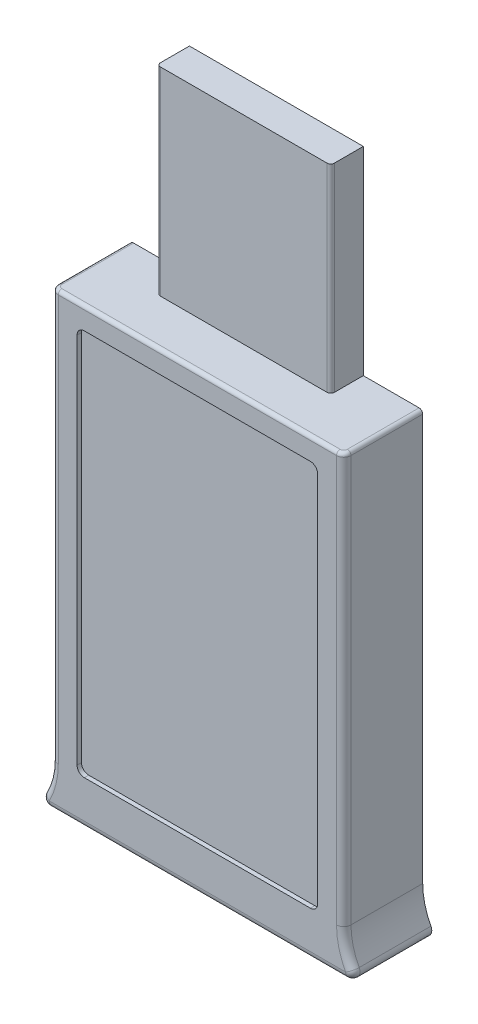
ISO-10303-21;
HEADER;
FILE_DESCRIPTION(('STEP AP214'),'2;1');
FILE_NAME('part.step','',(''),(''),'','','');
FILE_SCHEMA(('AUTOMOTIVE_DESIGN { 1 0 10303 214 1 1 1 1 }'));
ENDSEC;
DATA;
#1=APPLICATION_CONTEXT('core data for automotive mechanical design processes');
#2=APPLICATION_PROTOCOL_DEFINITION('international standard','automotive_design',2000,#1);
#3=PRODUCT_CONTEXT('',#1,'mechanical');
#4=PRODUCT('Part','Part','',(#3));
#5=PRODUCT_RELATED_PRODUCT_CATEGORY('part','',(#4));
#6=PRODUCT_DEFINITION_FORMATION('','',#4);
#7=PRODUCT_DEFINITION_CONTEXT('part definition',#1,'design');
#8=PRODUCT_DEFINITION('design','',#6,#7);
#9=PRODUCT_DEFINITION_SHAPE('','',#8);
#10=(LENGTH_UNIT() NAMED_UNIT(*) SI_UNIT(.MILLI.,.METRE.));
#11=(NAMED_UNIT(*) PLANE_ANGLE_UNIT() SI_UNIT($,.RADIAN.));
#12=(NAMED_UNIT(*) SI_UNIT($,.STERADIAN.) SOLID_ANGLE_UNIT());
#13=UNCERTAINTY_MEASURE_WITH_UNIT(LENGTH_MEASURE(1.E-05),#10,'distance_accuracy_value','');
#14=(GEOMETRIC_REPRESENTATION_CONTEXT(3) GLOBAL_UNCERTAINTY_ASSIGNED_CONTEXT((#13)) GLOBAL_UNIT_ASSIGNED_CONTEXT((#10,
#11,#12)) REPRESENTATION_CONTEXT('',''));
#15=CARTESIAN_POINT('',(0.,0.,0.));
#16=DIRECTION('',(0.,0.,1.));
#17=DIRECTION('',(1.,0.,0.));
#18=AXIS2_PLACEMENT_3D('',#15,#16,#17);
#19=CARTESIAN_POINT('',(0.,0.,-2.25));
#20=DIRECTION('',(1.,0.,0.));
#21=DIRECTION('',(0.,0.,-1.));
#22=AXIS2_PLACEMENT_3D('',#19,#20,#21);
#23=PLANE('',#22);
#24=DIRECTION('',(0.,0.,1.));
#25=VECTOR('',#24,1.);
#26=CARTESIAN_POINT('',(0.,13.7,-2.25));
#27=LINE('',#26,#25);
#28=CARTESIAN_POINT('',(0.,13.7,0.));
#29=VERTEX_POINT('',#28);
#30=CARTESIAN_POINT('',(0.,13.7,2.));
#31=VERTEX_POINT('',#30);
#32=EDGE_CURVE('E594',#29,#31,#27,.T.);
#33=ORIENTED_EDGE('',*,*,#32,.F.);
#34=DIRECTION('',(0.,-1.,0.));
#35=VECTOR('',#34,1.);
#36=CARTESIAN_POINT('',(0.,0.,0.));
#37=LINE('',#36,#35);
#38=CARTESIAN_POINT('',(0.,0.,0.));
#39=VERTEX_POINT('',#38);
#40=EDGE_CURVE('E249',#29,#39,#37,.T.);
#41=ORIENTED_EDGE('',*,*,#40,.T.);
#42=DIRECTION('',(0.,0.,1.));
#43=VECTOR('',#42,1.);
#44=CARTESIAN_POINT('',(0.,0.,-2.25));
#45=LINE('',#44,#43);
#46=CARTESIAN_POINT('',(0.,0.,2.));
#47=VERTEX_POINT('',#46);
#48=EDGE_CURVE('E247',#39,#47,#45,.T.);
#49=ORIENTED_EDGE('',*,*,#48,.T.);
#50=DIRECTION('',(0.,1.,0.));
#51=VECTOR('',#50,1.);
#52=CARTESIAN_POINT('',(0.,13.7,2.));
#53=LINE('',#52,#51);
#54=EDGE_CURVE('E295',#47,#31,#53,.T.);
#55=ORIENTED_EDGE('',*,*,#54,.T.);
#56=EDGE_LOOP('',(#33,#41,#49,#55));
#57=FACE_BOUND('',#56,.T.);
#58=ADVANCED_FACE('F47',(#57),#23,.F.);
#59=CARTESIAN_POINT('',(0.,13.7,-2.25));
#60=DIRECTION('',(0.,-1.,0.));
#61=DIRECTION('',(0.,0.,-1.));
#62=AXIS2_PLACEMENT_3D('',#59,#60,#61);
#63=PLANE('',#62);
#64=DIRECTION('',(0.,0.,1.));
#65=VECTOR('',#64,1.);
#66=CARTESIAN_POINT('',(12.,13.7,-2.25));
#67=LINE('',#66,#65);
#68=CARTESIAN_POINT('',(12.,13.7,0.));
#69=VERTEX_POINT('',#68);
#70=CARTESIAN_POINT('',(12.,13.7,2.));
#71=VERTEX_POINT('',#70);
#72=EDGE_CURVE('E70',#69,#71,#67,.T.);
#73=ORIENTED_EDGE('',*,*,#72,.F.);
#74=DIRECTION('',(1.,0.,0.));
#75=VECTOR('',#74,1.);
#76=CARTESIAN_POINT('',(0.3,13.7,0.));
#77=LINE('',#76,#75);
#78=EDGE_CURVE('E384',#29,#69,#77,.T.);
#79=ORIENTED_EDGE('',*,*,#78,.F.);
#80=ORIENTED_EDGE('',*,*,#32,.T.);
#81=CARTESIAN_POINT('',(0.25,13.7,2.));
#82=DIRECTION('',(0.,-1.,0.));
#83=DIRECTION('',(0.,0.,-1.));
#84=AXIS2_PLACEMENT_3D('',#81,#82,#83);
#85=CIRCLE('',#84,0.25);
#86=CARTESIAN_POINT('',(0.25,13.7,2.25));
#87=VERTEX_POINT('',#86);
#88=EDGE_CURVE('E286',#31,#87,#85,.F.);
#89=ORIENTED_EDGE('',*,*,#88,.T.);
#90=DIRECTION('',(1.,0.,0.));
#91=VECTOR('',#90,1.);
#92=CARTESIAN_POINT('',(0.,13.7,2.25));
#93=LINE('',#92,#91);
#94=CARTESIAN_POINT('',(11.75,13.7,2.25));
#95=VERTEX_POINT('',#94);
#96=EDGE_CURVE('E591',#87,#95,#93,.T.);
#97=ORIENTED_EDGE('',*,*,#96,.T.);
#98=CARTESIAN_POINT('',(11.75,13.7,2.));
#99=DIRECTION('',(0.,-1.,0.));
#100=DIRECTION('',(0.,0.,-1.));
#101=AXIS2_PLACEMENT_3D('',#98,#99,#100);
#102=CIRCLE('',#101,0.25);
#103=EDGE_CURVE('E289',#95,#71,#102,.F.);
#104=ORIENTED_EDGE('',*,*,#103,.T.);
#105=EDGE_LOOP('',(#73,#79,#80,#89,#97,#104));
#106=FACE_BOUND('',#105,.T.);
#107=ADVANCED_FACE('F636',(#106),#63,.F.);
#108=CARTESIAN_POINT('',(12.,0.,-2.25));
#109=DIRECTION('',(1.,0.,0.));
#110=DIRECTION('',(0.,0.,-1.));
#111=AXIS2_PLACEMENT_3D('',#108,#109,#110);
#112=PLANE('',#111);
#113=DIRECTION('',(0.,-1.,0.));
#114=VECTOR('',#113,1.);
#115=CARTESIAN_POINT('',(12.,0.,0.));
#116=LINE('',#115,#114);
#117=CARTESIAN_POINT('',(12.,0.,0.));
#118=VERTEX_POINT('',#117);
#119=EDGE_CURVE('E414',#69,#118,#116,.T.);
#120=ORIENTED_EDGE('',*,*,#119,.F.);
#121=ORIENTED_EDGE('',*,*,#72,.T.);
#122=DIRECTION('',(0.,1.,0.));
#123=VECTOR('',#122,1.);
#124=CARTESIAN_POINT('',(12.,0.,2.));
#125=LINE('',#124,#123);
#126=CARTESIAN_POINT('',(12.,0.,2.));
#127=VERTEX_POINT('',#126);
#128=EDGE_CURVE('E292',#71,#127,#125,.F.);
#129=ORIENTED_EDGE('',*,*,#128,.T.);
#130=DIRECTION('',(0.,0.,1.));
#131=VECTOR('',#130,1.);
#132=CARTESIAN_POINT('',(12.,0.,-2.25));
#133=LINE('',#132,#131);
#134=EDGE_CURVE('E588',#118,#127,#133,.T.);
#135=ORIENTED_EDGE('',*,*,#134,.F.);
#136=EDGE_LOOP('',(#120,#121,#129,#135));
#137=FACE_BOUND('',#136,.T.);
#138=ADVANCED_FACE('F643',(#137),#112,.T.);
#139=CARTESIAN_POINT('',(0.,0.,2.25));
#140=DIRECTION('',(0.,0.,1.));
#141=DIRECTION('',(1.,0.,0.));
#142=AXIS2_PLACEMENT_3D('',#139,#140,#141);
#143=PLANE('',#142);
#144=DIRECTION('',(1.,0.,0.));
#145=VECTOR('',#144,1.);
#146=CARTESIAN_POINT('',(0.,0.,2.25));
#147=LINE('',#146,#145);
#148=CARTESIAN_POINT('',(0.25,0.,2.25));
#149=VERTEX_POINT('',#148);
#150=CARTESIAN_POINT('',(11.75,0.,2.25));
#151=VERTEX_POINT('',#150);
#152=EDGE_CURVE('E602',#149,#151,#147,.T.);
#153=ORIENTED_EDGE('',*,*,#152,.T.);
#154=DIRECTION('',(0.,1.,0.));
#155=VECTOR('',#154,1.);
#156=CARTESIAN_POINT('',(11.75,0.,2.25));
#157=LINE('',#156,#155);
#158=EDGE_CURVE('E282',#151,#95,#157,.T.);
#159=ORIENTED_EDGE('',*,*,#158,.T.);
#160=ORIENTED_EDGE('',*,*,#96,.F.);
#161=DIRECTION('',(0.,1.,0.));
#162=VECTOR('',#161,1.);
#163=CARTESIAN_POINT('',(0.25,0.,2.25));
#164=LINE('',#163,#162);
#165=EDGE_CURVE('E279',#87,#149,#164,.F.);
#166=ORIENTED_EDGE('',*,*,#165,.T.);
#167=EDGE_LOOP('',(#153,#159,#160,#166));
#168=FACE_BOUND('',#167,.T.);
#169=ADVANCED_FACE('F648',(#168),#143,.T.);
#170=CARTESIAN_POINT('',(16.1,0.,43.4196706915668));
#171=DIRECTION('',(1.,0.,0.));
#172=DIRECTION('',(0.,0.,-1.));
#173=AXIS2_PLACEMENT_3D('',#170,#171,#172);
#174=PLANE('',#173);
#175=DIRECTION('',(0.,-1.,0.));
#176=VECTOR('',#175,1.);
#177=CARTESIAN_POINT('',(16.1,0.,0.));
#178=LINE('',#177,#176);
#179=CARTESIAN_POINT('',(16.1,-0.25,0.));
#180=VERTEX_POINT('',#179);
#181=CARTESIAN_POINT('',(16.1,-28.3,0.));
#182=VERTEX_POINT('',#181);
#183=EDGE_CURVE('E360',#180,#182,#178,.T.);
#184=ORIENTED_EDGE('',*,*,#183,.F.);
#185=DIRECTION('',(0.,0.,-1.));
#186=VECTOR('',#185,1.);
#187=CARTESIAN_POINT('',(16.1,-0.25,43.4196706915668));
#188=LINE('',#187,#186);
#189=CARTESIAN_POINT('',(16.1,-0.25,4.95));
#190=VERTEX_POINT('',#189);
#191=EDGE_CURVE('E273',#180,#190,#188,.F.);
#192=ORIENTED_EDGE('',*,*,#191,.T.);
#193=DIRECTION('',(0.,-1.,0.));
#194=VECTOR('',#193,1.);
#195=CARTESIAN_POINT('',(16.1,0.,4.95));
#196=LINE('',#195,#194);
#197=CARTESIAN_POINT('',(16.1,-28.3,4.95));
#198=VERTEX_POINT('',#197);
#199=EDGE_CURVE('E496',#190,#198,#196,.T.);
#200=ORIENTED_EDGE('',*,*,#199,.T.);
#201=DIRECTION('',(0.,0.,-1.));
#202=VECTOR('',#201,1.);
#203=CARTESIAN_POINT('',(16.1,-28.3,43.4196706915668));
#204=LINE('',#203,#202);
#205=EDGE_CURVE('E404',#198,#182,#204,.T.);
#206=ORIENTED_EDGE('',*,*,#205,.T.);
#207=EDGE_LOOP('',(#184,#192,#200,#206));
#208=FACE_BOUND('',#207,.T.);
#209=ADVANCED_FACE('F665',(#208),#174,.T.);
#210=CARTESIAN_POINT('',(0.,0.,43.4196706915668));
#211=DIRECTION('',(0.,1.,0.));
#212=DIRECTION('',(0.,0.,1.));
#213=AXIS2_PLACEMENT_3D('',#210,#211,#212);
#214=PLANE('',#213);
#215=DIRECTION('',(1.,0.,0.));
#216=VECTOR('',#215,1.);
#217=CARTESIAN_POINT('',(0.,0.,0.));
#218=LINE('',#217,#216);
#219=CARTESIAN_POINT('',(-3.85,0.,0.));
#220=VERTEX_POINT('',#219);
#221=EDGE_CURVE('E234',#220,#39,#218,.T.);
#222=ORIENTED_EDGE('',*,*,#221,.F.);
#223=DIRECTION('',(0.,0.,-1.));
#224=VECTOR('',#223,1.);
#225=CARTESIAN_POINT('',(-3.85,0.,4.95));
#226=LINE('',#225,#224);
#227=CARTESIAN_POINT('',(-3.85,0.,4.95));
#228=VERTEX_POINT('',#227);
#229=EDGE_CURVE('E244',#220,#228,#226,.F.);
#230=ORIENTED_EDGE('',*,*,#229,.T.);
#231=CARTESIAN_POINT('',(-3.6,0.,4.95));
#232=DIRECTION('',(0.,1.,0.));
#233=DIRECTION('',(0.,0.,1.));
#234=AXIS2_PLACEMENT_3D('',#231,#232,#233);
#235=CIRCLE('',#234,0.25);
#236=CARTESIAN_POINT('',(-3.6,0.,5.2));
#237=VERTEX_POINT('',#236);
#238=EDGE_CURVE('E255',#228,#237,#235,.T.);
#239=ORIENTED_EDGE('',*,*,#238,.T.);
#240=DIRECTION('',(1.,0.,0.));
#241=VECTOR('',#240,1.);
#242=CARTESIAN_POINT('',(0.,0.,5.2));
#243=LINE('',#242,#241);
#244=CARTESIAN_POINT('',(15.6,0.,5.2));
#245=VERTEX_POINT('',#244);
#246=EDGE_CURVE('E347',#237,#245,#243,.T.);
#247=ORIENTED_EDGE('',*,*,#246,.T.);
#248=CARTESIAN_POINT('',(15.6,0.,4.95));
#249=DIRECTION('',(0.,1.,0.));
#250=DIRECTION('',(0.,0.,1.));
#251=AXIS2_PLACEMENT_3D('',#248,#249,#250);
#252=CIRCLE('',#251,0.25);
#253=CARTESIAN_POINT('',(15.85,0.,4.95));
#254=VERTEX_POINT('',#253);
#255=EDGE_CURVE('E263',#245,#254,#252,.T.);
#256=ORIENTED_EDGE('',*,*,#255,.T.);
#257=DIRECTION('',(0.,0.,-1.));
#258=VECTOR('',#257,1.);
#259=CARTESIAN_POINT('',(15.85,0.,43.4196706915668));
#260=LINE('',#259,#258);
#261=CARTESIAN_POINT('',(15.85,0.,0.));
#262=VERTEX_POINT('',#261);
#263=EDGE_CURVE('E256',#254,#262,#260,.T.);
#264=ORIENTED_EDGE('',*,*,#263,.T.);
#265=EDGE_CURVE('E250',#118,#262,#218,.T.);
#266=ORIENTED_EDGE('',*,*,#265,.F.);
#267=ORIENTED_EDGE('',*,*,#134,.T.);
#268=CARTESIAN_POINT('',(11.75,0.,2.));
#269=DIRECTION('',(0.,1.,0.));
#270=DIRECTION('',(0.,0.,1.));
#271=AXIS2_PLACEMENT_3D('',#268,#269,#270);
#272=CIRCLE('',#271,0.25);
#273=EDGE_CURVE('E302',#127,#151,#272,.F.);
#274=ORIENTED_EDGE('',*,*,#273,.T.);
#275=ORIENTED_EDGE('',*,*,#152,.F.);
#276=CARTESIAN_POINT('',(0.25,0.,2.));
#277=DIRECTION('',(0.,1.,0.));
#278=DIRECTION('',(0.,0.,1.));
#279=AXIS2_PLACEMENT_3D('',#276,#277,#278);
#280=CIRCLE('',#279,0.25);
#281=EDGE_CURVE('E56',#149,#47,#280,.F.);
#282=ORIENTED_EDGE('',*,*,#281,.T.);
#283=ORIENTED_EDGE('',*,*,#48,.F.);
#284=EDGE_LOOP('',(#222,#230,#239,#247,#256,#264,#266,#267,#274,#275,#282,#283));
#285=FACE_BOUND('',#284,.T.);
#286=ADVANCED_FACE('F242',(#285),#214,.T.);
#287=CARTESIAN_POINT('',(-4.1,0.,43.4196706915668));
#288=DIRECTION('',(1.,0.,0.));
#289=DIRECTION('',(0.,1.,0.));
#290=AXIS2_PLACEMENT_3D('',#287,#288,#289);
#291=PLANE('',#290);
#292=DIRECTION('',(0.,0.,-1.));
#293=VECTOR('',#292,1.);
#294=CARTESIAN_POINT('',(-4.1,-0.25,-4.65));
#295=LINE('',#294,#293);
#296=CARTESIAN_POINT('',(-4.1,-0.25,4.95));
#297=VERTEX_POINT('',#296);
#298=CARTESIAN_POINT('',(-4.1,-0.25,0.));
#299=VERTEX_POINT('',#298);
#300=EDGE_CURVE('E270',#297,#299,#295,.T.);
#301=ORIENTED_EDGE('',*,*,#300,.T.);
#302=DIRECTION('',(0.,-1.,0.));
#303=VECTOR('',#302,1.);
#304=CARTESIAN_POINT('',(-4.1,0.,0.));
#305=LINE('',#304,#303);
#306=CARTESIAN_POINT('',(-4.1,-28.3,0.));
#307=VERTEX_POINT('',#306);
#308=EDGE_CURVE('E62',#299,#307,#305,.T.);
#309=ORIENTED_EDGE('',*,*,#308,.T.);
#310=DIRECTION('',(0.,0.,-1.));
#311=VECTOR('',#310,1.);
#312=CARTESIAN_POINT('',(-4.1,-28.3,43.4196706915668));
#313=LINE('',#312,#311);
#314=CARTESIAN_POINT('',(-4.1,-28.3,4.95));
#315=VERTEX_POINT('',#314);
#316=EDGE_CURVE('E405',#315,#307,#313,.T.);
#317=ORIENTED_EDGE('',*,*,#316,.F.);
#318=DIRECTION('',(0.,-1.,0.));
#319=VECTOR('',#318,1.);
#320=CARTESIAN_POINT('',(-4.1,0.,4.95));
#321=LINE('',#320,#319);
#322=EDGE_CURVE('E569',#315,#297,#321,.F.);
#323=ORIENTED_EDGE('',*,*,#322,.T.);
#324=EDGE_LOOP('',(#301,#309,#317,#323));
#325=FACE_BOUND('',#324,.T.);
#326=ADVANCED_FACE('F616',(#325),#291,.F.);
#327=CARTESIAN_POINT('',(0.,0.,5.45));
#328=DIRECTION('',(0.,0.,1.));
#329=DIRECTION('',(1.,0.,0.));
#330=AXIS2_PLACEMENT_3D('',#327,#328,#329);
#331=PLANE('',#330);
#332=DIRECTION('',(0.,1.,0.));
#333=VECTOR('',#332,1.);
#334=CARTESIAN_POINT('',(14.3,-1.5,5.45));
#335=LINE('',#334,#333);
#336=CARTESIAN_POINT('',(14.3,-27.7,5.45));
#337=VERTEX_POINT('',#336);
#338=CARTESIAN_POINT('',(14.3,-2.,5.45));
#339=VERTEX_POINT('',#338);
#340=EDGE_CURVE('E385',#337,#339,#335,.T.);
#341=ORIENTED_EDGE('',*,*,#340,.F.);
#342=CARTESIAN_POINT('',(13.8,-27.7,5.45));
#343=DIRECTION('',(0.,0.,1.));
#344=DIRECTION('',(1.,0.,0.));
#345=AXIS2_PLACEMENT_3D('',#342,#343,#344);
#346=CIRCLE('',#345,0.5);
#347=CARTESIAN_POINT('',(13.8,-28.2,5.45));
#348=VERTEX_POINT('',#347);
#349=EDGE_CURVE('E513',#337,#348,#346,.F.);
#350=ORIENTED_EDGE('',*,*,#349,.T.);
#351=DIRECTION('',(1.,0.,0.));
#352=VECTOR('',#351,1.);
#353=CARTESIAN_POINT('',(14.3,-28.2,5.45));
#354=LINE('',#353,#352);
#355=CARTESIAN_POINT('',(-1.8,-28.2,5.45));
#356=VERTEX_POINT('',#355);
#357=EDGE_CURVE('E372',#356,#348,#354,.T.);
#358=ORIENTED_EDGE('',*,*,#357,.F.);
#359=CARTESIAN_POINT('',(-1.8,-27.7,5.45));
#360=DIRECTION('',(0.,0.,1.));
#361=DIRECTION('',(1.,0.,0.));
#362=AXIS2_PLACEMENT_3D('',#359,#360,#361);
#363=CIRCLE('',#362,0.5);
#364=CARTESIAN_POINT('',(-2.3,-27.7,5.45));
#365=VERTEX_POINT('',#364);
#366=EDGE_CURVE('E523',#356,#365,#363,.F.);
#367=ORIENTED_EDGE('',*,*,#366,.T.);
#368=DIRECTION('',(0.,-1.,0.));
#369=VECTOR('',#368,1.);
#370=CARTESIAN_POINT('',(-2.3,-1.5,5.45));
#371=LINE('',#370,#369);
#372=CARTESIAN_POINT('',(-2.3,-2.,5.45));
#373=VERTEX_POINT('',#372);
#374=EDGE_CURVE('E394',#373,#365,#371,.T.);
#375=ORIENTED_EDGE('',*,*,#374,.F.);
#376=CARTESIAN_POINT('',(-1.8,-2.,5.45));
#377=DIRECTION('',(0.,0.,1.));
#378=DIRECTION('',(1.,0.,0.));
#379=AXIS2_PLACEMENT_3D('',#376,#377,#378);
#380=CIRCLE('',#379,0.5);
#381=CARTESIAN_POINT('',(-1.8,-1.5,5.45));
#382=VERTEX_POINT('',#381);
#383=EDGE_CURVE('E526',#373,#382,#380,.F.);
#384=ORIENTED_EDGE('',*,*,#383,.T.);
#385=DIRECTION('',(-1.,0.,0.));
#386=VECTOR('',#385,1.);
#387=CARTESIAN_POINT('',(14.3,-1.5,5.45));
#388=LINE('',#387,#386);
#389=CARTESIAN_POINT('',(13.8,-1.5,5.45));
#390=VERTEX_POINT('',#389);
#391=EDGE_CURVE('E389',#390,#382,#388,.T.);
#392=ORIENTED_EDGE('',*,*,#391,.F.);
#393=CARTESIAN_POINT('',(13.8,-2.,5.45));
#394=DIRECTION('',(0.,0.,1.));
#395=DIRECTION('',(1.,0.,0.));
#396=AXIS2_PLACEMENT_3D('',#393,#394,#395);
#397=CIRCLE('',#396,0.5);
#398=EDGE_CURVE('E511',#390,#339,#397,.F.);
#399=ORIENTED_EDGE('',*,*,#398,.T.);
#400=EDGE_LOOP('',(#341,#350,#358,#367,#375,#384,#392,#399));
#401=FACE_BOUND('',#400,.T.);
#402=DIRECTION('',(0.,-1.,0.));
#403=VECTOR('',#402,1.);
#404=CARTESIAN_POINT('',(15.6,0.,5.45));
#405=LINE('',#404,#403);
#406=CARTESIAN_POINT('',(15.6,-28.3,5.45));
#407=VERTEX_POINT('',#406);
#408=CARTESIAN_POINT('',(15.6,-0.25,5.45));
#409=VERTEX_POINT('',#408);
#410=EDGE_CURVE('E497',#407,#409,#405,.F.);
#411=ORIENTED_EDGE('',*,*,#410,.T.);
#412=DIRECTION('',(1.,0.,0.));
#413=VECTOR('',#412,1.);
#414=CARTESIAN_POINT('',(0.,-0.25,5.45));
#415=LINE('',#414,#413);
#416=CARTESIAN_POINT('',(-3.6,-0.25,5.45));
#417=VERTEX_POINT('',#416);
#418=EDGE_CURVE('E299',#409,#417,#415,.F.);
#419=ORIENTED_EDGE('',*,*,#418,.T.);
#420=DIRECTION('',(0.,-1.,0.));
#421=VECTOR('',#420,1.);
#422=CARTESIAN_POINT('',(-3.6,-28.3,5.45));
#423=LINE('',#422,#421);
#424=CARTESIAN_POINT('',(-3.6,-28.3,5.45));
#425=VERTEX_POINT('',#424);
#426=EDGE_CURVE('E579',#417,#425,#423,.T.);
#427=ORIENTED_EDGE('',*,*,#426,.T.);
#428=CARTESIAN_POINT('',(-8.91428571428568,-28.3,5.45));
#429=DIRECTION('',(0.,0.,1.));
#430=DIRECTION('',(1.,0.,0.));
#431=AXIS2_PLACEMENT_3D('',#428,#429,#430);
#432=CIRCLE('',#431,5.31428571428568);
#433=CARTESIAN_POINT('',(-4.22476200146996,-30.8,5.45));
#434=VERTEX_POINT('',#433);
#435=EDGE_CURVE('E489',#425,#434,#432,.F.);
#436=ORIENTED_EDGE('',*,*,#435,.T.);
#437=DIRECTION('',(1.,0.,0.));
#438=VECTOR('',#437,1.);
#439=CARTESIAN_POINT('',(16.3,-30.8,5.45));
#440=LINE('',#439,#438);
#441=CARTESIAN_POINT('',(16.22476200147,-30.8,5.45));
#442=VERTEX_POINT('',#441);
#443=EDGE_CURVE('E336',#434,#442,#440,.T.);
#444=ORIENTED_EDGE('',*,*,#443,.T.);
#445=CARTESIAN_POINT('',(20.9142857142857,-28.3,5.45));
#446=DIRECTION('',(0.,0.,1.));
#447=DIRECTION('',(1.,0.,0.));
#448=AXIS2_PLACEMENT_3D('',#445,#446,#447);
#449=CIRCLE('',#448,5.31428571428568);
#450=EDGE_CURVE('E486',#442,#407,#449,.F.);
#451=ORIENTED_EDGE('',*,*,#450,.T.);
#452=EDGE_LOOP('',(#411,#419,#427,#436,#444,#451));
#453=FACE_BOUND('',#452,.T.);
#454=ADVANCED_FACE('F485',(#401,#453),#331,.T.);
#455=CARTESIAN_POINT('',(20.9142857142857,-28.3,27.2573382144635));
#456=DIRECTION('',(0.,0.,-1.));
#457=DIRECTION('',(-1.,0.,0.));
#458=AXIS2_PLACEMENT_3D('',#455,#456,#457);
#459=CYLINDRICAL_SURFACE('',#458,4.81428571428568);
#460=CARTESIAN_POINT('',(20.9142857142857,-28.3,0.));
#461=DIRECTION('',(0.,0.,1.));
#462=DIRECTION('',(1.,0.,0.));
#463=AXIS2_PLACEMENT_3D('',#460,#461,#462);
#464=CIRCLE('',#463,4.81428571428568);
#465=CARTESIAN_POINT('',(16.6659806303639,-30.5647849462366,0.));
#466=VERTEX_POINT('',#465);
#467=EDGE_CURVE('E424',#182,#466,#464,.T.);
#468=ORIENTED_EDGE('',*,*,#467,.F.);
#469=ORIENTED_EDGE('',*,*,#205,.F.);
#470=CARTESIAN_POINT('',(20.9142857142857,-28.3,4.95));
#471=DIRECTION('',(0.,0.,1.));
#472=DIRECTION('',(1.,0.,0.));
#473=AXIS2_PLACEMENT_3D('',#470,#471,#472);
#474=CIRCLE('',#473,4.81428571428568);
#475=CARTESIAN_POINT('',(16.6659806303639,-30.5647849462366,4.95));
#476=VERTEX_POINT('',#475);
#477=EDGE_CURVE('E585',#198,#476,#474,.T.);
#478=ORIENTED_EDGE('',*,*,#477,.T.);
#479=DIRECTION('',(0.,0.,-1.));
#480=VECTOR('',#479,1.);
#481=CARTESIAN_POINT('',(16.6659806303639,-30.5647849462366,27.2573382144635));
#482=LINE('',#481,#480);
#483=EDGE_CURVE('E472',#476,#466,#482,.T.);
#484=ORIENTED_EDGE('',*,*,#483,.T.);
#485=EDGE_LOOP('',(#468,#469,#478,#484));
#486=FACE_BOUND('',#485,.T.);
#487=ADVANCED_FACE('F668',(#486),#459,.F.);
#488=CARTESIAN_POINT('',(-8.91428571428568,-28.3,27.2573382144635));
#489=DIRECTION('',(0.,0.,-1.));
#490=DIRECTION('',(-1.,0.,0.));
#491=AXIS2_PLACEMENT_3D('',#488,#489,#490);
#492=CYLINDRICAL_SURFACE('',#491,4.81428571428568);
#493=ORIENTED_EDGE('',*,*,#316,.T.);
#494=CARTESIAN_POINT('',(-8.91428571428568,-28.3,0.));
#495=DIRECTION('',(0.,0.,1.));
#496=DIRECTION('',(1.,0.,0.));
#497=AXIS2_PLACEMENT_3D('',#494,#495,#496);
#498=CIRCLE('',#497,4.81428571428568);
#499=CARTESIAN_POINT('',(-4.66598063036392,-30.5647849462366,0.));
#500=VERTEX_POINT('',#499);
#501=EDGE_CURVE('E437',#307,#500,#498,.F.);
#502=ORIENTED_EDGE('',*,*,#501,.T.);
#503=DIRECTION('',(0.,0.,-1.));
#504=VECTOR('',#503,1.);
#505=CARTESIAN_POINT('',(-4.66598063036392,-30.5647849462366,27.2573382144635));
#506=LINE('',#505,#504);
#507=CARTESIAN_POINT('',(-4.66598063036392,-30.5647849462366,4.95));
#508=VERTEX_POINT('',#507);
#509=EDGE_CURVE('E464',#500,#508,#506,.F.);
#510=ORIENTED_EDGE('',*,*,#509,.T.);
#511=CARTESIAN_POINT('',(-8.91428571428568,-28.3,4.95));
#512=DIRECTION('',(0.,0.,1.));
#513=DIRECTION('',(1.,0.,0.));
#514=AXIS2_PLACEMENT_3D('',#511,#512,#513);
#515=CIRCLE('',#514,4.81428571428568);
#516=EDGE_CURVE('E582',#508,#315,#515,.T.);
#517=ORIENTED_EDGE('',*,*,#516,.T.);
#518=EDGE_LOOP('',(#493,#502,#510,#517));
#519=FACE_BOUND('',#518,.T.);
#520=ADVANCED_FACE('F613',(#519),#492,.F.);
#521=CARTESIAN_POINT('',(0.,-31.3,27.2573382144635));
#522=DIRECTION('',(0.,1.,0.));
#523=DIRECTION('',(0.,0.,1.));
#524=AXIS2_PLACEMENT_3D('',#521,#522,#523);
#525=PLANE('',#524);
#526=DIRECTION('',(0.,0.,-1.));
#527=VECTOR('',#526,1.);
#528=CARTESIAN_POINT('',(-4.22476200146996,-31.3,27.2573382144635));
#529=LINE('',#528,#527);
#530=CARTESIAN_POINT('',(-4.22476200146996,-31.3,4.95));
#531=VERTEX_POINT('',#530);
#532=CARTESIAN_POINT('',(-4.22476200146996,-31.3,0.));
#533=VERTEX_POINT('',#532);
#534=EDGE_CURVE('E452',#531,#533,#529,.T.);
#535=ORIENTED_EDGE('',*,*,#534,.T.);
#536=DIRECTION('',(1.,0.,0.));
#537=VECTOR('',#536,1.);
#538=CARTESIAN_POINT('',(0.,-31.3,0.));
#539=LINE('',#538,#537);
#540=CARTESIAN_POINT('',(16.22476200147,-31.3,0.));
#541=VERTEX_POINT('',#540);
#542=EDGE_CURVE('E420',#533,#541,#539,.T.);
#543=ORIENTED_EDGE('',*,*,#542,.T.);
#544=DIRECTION('',(0.,0.,1.));
#545=VECTOR('',#544,1.);
#546=CARTESIAN_POINT('',(16.22476200147,-31.3,-4.65));
#547=LINE('',#546,#545);
#548=CARTESIAN_POINT('',(16.22476200147,-31.3,4.95));
#549=VERTEX_POINT('',#548);
#550=EDGE_CURVE('E449',#541,#549,#547,.T.);
#551=ORIENTED_EDGE('',*,*,#550,.T.);
#552=DIRECTION('',(1.,0.,0.));
#553=VECTOR('',#552,1.);
#554=CARTESIAN_POINT('',(-4.3,-31.3,4.95));
#555=LINE('',#554,#553);
#556=EDGE_CURVE('E460',#549,#531,#555,.F.);
#557=ORIENTED_EDGE('',*,*,#556,.T.);
#558=EDGE_LOOP('',(#535,#543,#551,#557));
#559=FACE_BOUND('',#558,.T.);
#560=ADVANCED_FACE('F448',(#559),#525,.F.);
#561=CARTESIAN_POINT('',(0.3,4.7,0.));
#562=DIRECTION('',(0.,0.,1.));
#563=DIRECTION('',(1.,0.,0.));
#564=AXIS2_PLACEMENT_3D('',#561,#562,#563);
#565=PLANE('',#564);
#566=ORIENTED_EDGE('',*,*,#40,.F.);
#567=ORIENTED_EDGE('',*,*,#78,.T.);
#568=ORIENTED_EDGE('',*,*,#119,.T.);
#569=ORIENTED_EDGE('',*,*,#265,.T.);
#570=CARTESIAN_POINT('',(15.85,-0.25,0.));
#571=DIRECTION('',(0.,0.,1.));
#572=DIRECTION('',(1.,0.,0.));
#573=AXIS2_PLACEMENT_3D('',#570,#571,#572);
#574=CIRCLE('',#573,0.25);
#575=EDGE_CURVE('E310',#262,#180,#574,.F.);
#576=ORIENTED_EDGE('',*,*,#575,.T.);
#577=ORIENTED_EDGE('',*,*,#183,.T.);
#578=ORIENTED_EDGE('',*,*,#467,.T.);
#579=CARTESIAN_POINT('',(16.22476200147,-30.8,0.));
#580=DIRECTION('',(0.,0.,1.));
#581=DIRECTION('',(1.,0.,0.));
#582=AXIS2_PLACEMENT_3D('',#579,#580,#581);
#583=CIRCLE('',#582,0.5);
#584=EDGE_CURVE('E419',#466,#541,#583,.F.);
#585=ORIENTED_EDGE('',*,*,#584,.T.);
#586=ORIENTED_EDGE('',*,*,#542,.F.);
#587=CARTESIAN_POINT('',(-4.22476200146996,-30.8,0.));
#588=DIRECTION('',(0.,0.,1.));
#589=DIRECTION('',(1.,0.,0.));
#590=AXIS2_PLACEMENT_3D('',#587,#588,#589);
#591=CIRCLE('',#590,0.5);
#592=EDGE_CURVE('E440',#533,#500,#591,.F.);
#593=ORIENTED_EDGE('',*,*,#592,.T.);
#594=ORIENTED_EDGE('',*,*,#501,.F.);
#595=ORIENTED_EDGE('',*,*,#308,.F.);
#596=CARTESIAN_POINT('',(-3.85,-0.25,0.));
#597=DIRECTION('',(0.,0.,1.));
#598=DIRECTION('',(1.,0.,0.));
#599=AXIS2_PLACEMENT_3D('',#596,#597,#598);
#600=CIRCLE('',#599,0.25);
#601=EDGE_CURVE('E13',#299,#220,#600,.F.);
#602=ORIENTED_EDGE('',*,*,#601,.T.);
#603=ORIENTED_EDGE('',*,*,#221,.T.);
#604=EDGE_LOOP('',(#566,#567,#568,#569,#576,#577,#578,#585,#586,#593,#594,#595,#602,#603));
#605=FACE_BOUND('',#604,.T.);
#606=ADVANCED_FACE('F233',(#605),#565,.F.);
#607=CARTESIAN_POINT('',(14.3,-1.5,5.15));
#608=DIRECTION('',(1.,0.,0.));
#609=DIRECTION('',(0.,1.,0.));
#610=AXIS2_PLACEMENT_3D('',#607,#608,#609);
#611=PLANE('',#610);
#612=DIRECTION('',(0.,1.,0.));
#613=VECTOR('',#612,1.);
#614=CARTESIAN_POINT('',(14.3,-1.5,5.15));
#615=LINE('',#614,#613);
#616=CARTESIAN_POINT('',(14.3,-27.7,5.15));
#617=VERTEX_POINT('',#616);
#618=CARTESIAN_POINT('',(14.3,-2.,5.15));
#619=VERTEX_POINT('',#618);
#620=EDGE_CURVE('E367',#617,#619,#615,.T.);
#621=ORIENTED_EDGE('',*,*,#620,.F.);
#622=DIRECTION('',(0.,0.,1.));
#623=VECTOR('',#622,1.);
#624=CARTESIAN_POINT('',(14.3,-27.7,5.45));
#625=LINE('',#624,#623);
#626=EDGE_CURVE('E529',#617,#337,#625,.T.);
#627=ORIENTED_EDGE('',*,*,#626,.T.);
#628=ORIENTED_EDGE('',*,*,#340,.T.);
#629=DIRECTION('',(0.,0.,1.));
#630=VECTOR('',#629,1.);
#631=CARTESIAN_POINT('',(14.3,-2.,5.15));
#632=LINE('',#631,#630);
#633=EDGE_CURVE('E533',#339,#619,#632,.F.);
#634=ORIENTED_EDGE('',*,*,#633,.T.);
#635=EDGE_LOOP('',(#621,#627,#628,#634));
#636=FACE_BOUND('',#635,.T.);
#637=ADVANCED_FACE('F763',(#636),#611,.F.);
#638=CARTESIAN_POINT('',(14.3,-28.2,5.15));
#639=DIRECTION('',(0.,-1.,0.));
#640=DIRECTION('',(0.,0.,-1.));
#641=AXIS2_PLACEMENT_3D('',#638,#639,#640);
#642=PLANE('',#641);
#643=DIRECTION('',(1.,0.,0.));
#644=VECTOR('',#643,1.);
#645=CARTESIAN_POINT('',(14.3,-28.2,5.15));
#646=LINE('',#645,#644);
#647=CARTESIAN_POINT('',(-1.8,-28.2,5.15));
#648=VERTEX_POINT('',#647);
#649=CARTESIAN_POINT('',(13.8,-28.2,5.15));
#650=VERTEX_POINT('',#649);
#651=EDGE_CURVE('E380',#648,#650,#646,.T.);
#652=ORIENTED_EDGE('',*,*,#651,.F.);
#653=DIRECTION('',(0.,0.,1.));
#654=VECTOR('',#653,1.);
#655=CARTESIAN_POINT('',(-1.8,-28.2,5.45));
#656=LINE('',#655,#654);
#657=EDGE_CURVE('E536',#648,#356,#656,.T.);
#658=ORIENTED_EDGE('',*,*,#657,.T.);
#659=ORIENTED_EDGE('',*,*,#357,.T.);
#660=DIRECTION('',(0.,0.,1.));
#661=VECTOR('',#660,1.);
#662=CARTESIAN_POINT('',(13.8,-28.2,5.15));
#663=LINE('',#662,#661);
#664=EDGE_CURVE('E540',#348,#650,#663,.F.);
#665=ORIENTED_EDGE('',*,*,#664,.T.);
#666=EDGE_LOOP('',(#652,#658,#659,#665));
#667=FACE_BOUND('',#666,.T.);
#668=ADVANCED_FACE('F756',(#667),#642,.F.);
#669=CARTESIAN_POINT('',(-2.3,-1.5,5.15));
#670=DIRECTION('',(-1.,0.,0.));
#671=DIRECTION('',(0.,-1.,0.));
#672=AXIS2_PLACEMENT_3D('',#669,#670,#671);
#673=PLANE('',#672);
#674=DIRECTION('',(0.,-1.,0.));
#675=VECTOR('',#674,1.);
#676=CARTESIAN_POINT('',(-2.3,-1.5,5.15));
#677=LINE('',#676,#675);
#678=CARTESIAN_POINT('',(-2.3,-2.,5.15));
#679=VERTEX_POINT('',#678);
#680=CARTESIAN_POINT('',(-2.3,-27.7,5.15));
#681=VERTEX_POINT('',#680);
#682=EDGE_CURVE('E376',#679,#681,#677,.T.);
#683=ORIENTED_EDGE('',*,*,#682,.F.);
#684=DIRECTION('',(0.,0.,1.));
#685=VECTOR('',#684,1.);
#686=CARTESIAN_POINT('',(-2.3,-2.,5.45));
#687=LINE('',#686,#685);
#688=EDGE_CURVE('E562',#679,#373,#687,.T.);
#689=ORIENTED_EDGE('',*,*,#688,.T.);
#690=ORIENTED_EDGE('',*,*,#374,.T.);
#691=DIRECTION('',(0.,0.,1.));
#692=VECTOR('',#691,1.);
#693=CARTESIAN_POINT('',(-2.3,-27.7,5.15));
#694=LINE('',#693,#692);
#695=EDGE_CURVE('E566',#365,#681,#694,.F.);
#696=ORIENTED_EDGE('',*,*,#695,.T.);
#697=EDGE_LOOP('',(#683,#689,#690,#696));
#698=FACE_BOUND('',#697,.T.);
#699=ADVANCED_FACE('F774',(#698),#673,.F.);
#700=CARTESIAN_POINT('',(14.3,-1.5,5.15));
#701=DIRECTION('',(0.,1.,0.));
#702=DIRECTION('',(0.,0.,1.));
#703=AXIS2_PLACEMENT_3D('',#700,#701,#702);
#704=PLANE('',#703);
#705=ORIENTED_EDGE('',*,*,#391,.T.);
#706=DIRECTION('',(0.,0.,1.));
#707=VECTOR('',#706,1.);
#708=CARTESIAN_POINT('',(-1.8,-1.5,5.15));
#709=LINE('',#708,#707);
#710=CARTESIAN_POINT('',(-1.8,-1.5,5.15));
#711=VERTEX_POINT('',#710);
#712=EDGE_CURVE('E555',#382,#711,#709,.F.);
#713=ORIENTED_EDGE('',*,*,#712,.T.);
#714=DIRECTION('',(-1.,0.,0.));
#715=VECTOR('',#714,1.);
#716=CARTESIAN_POINT('',(14.3,-1.5,5.15));
#717=LINE('',#716,#715);
#718=CARTESIAN_POINT('',(13.8,-1.5,5.15));
#719=VERTEX_POINT('',#718);
#720=EDGE_CURVE('E371',#719,#711,#717,.T.);
#721=ORIENTED_EDGE('',*,*,#720,.F.);
#722=DIRECTION('',(0.,0.,1.));
#723=VECTOR('',#722,1.);
#724=CARTESIAN_POINT('',(13.8,-1.5,5.45));
#725=LINE('',#724,#723);
#726=EDGE_CURVE('E558',#719,#390,#725,.T.);
#727=ORIENTED_EDGE('',*,*,#726,.T.);
#728=EDGE_LOOP('',(#705,#713,#721,#727));
#729=FACE_BOUND('',#728,.T.);
#730=ADVANCED_FACE('F661',(#729),#704,.F.);
#731=CARTESIAN_POINT('',(0.,0.,5.15));
#732=DIRECTION('',(0.,0.,-1.));
#733=DIRECTION('',(-1.,0.,0.));
#734=AXIS2_PLACEMENT_3D('',#731,#732,#733);
#735=PLANE('',#734);
#736=ORIENTED_EDGE('',*,*,#720,.T.);
#737=CARTESIAN_POINT('',(-1.8,-2.,5.15));
#738=DIRECTION('',(0.,0.,-1.));
#739=DIRECTION('',(-1.,0.,0.));
#740=AXIS2_PLACEMENT_3D('',#737,#738,#739);
#741=CIRCLE('',#740,0.5);
#742=EDGE_CURVE('E543',#711,#679,#741,.F.);
#743=ORIENTED_EDGE('',*,*,#742,.T.);
#744=ORIENTED_EDGE('',*,*,#682,.T.);
#745=CARTESIAN_POINT('',(-1.8,-27.7,5.15));
#746=DIRECTION('',(0.,0.,-1.));
#747=DIRECTION('',(-1.,0.,0.));
#748=AXIS2_PLACEMENT_3D('',#745,#746,#747);
#749=CIRCLE('',#748,0.5);
#750=EDGE_CURVE('E546',#681,#648,#749,.F.);
#751=ORIENTED_EDGE('',*,*,#750,.T.);
#752=ORIENTED_EDGE('',*,*,#651,.T.);
#753=CARTESIAN_POINT('',(13.8,-27.7,5.15));
#754=DIRECTION('',(0.,0.,-1.));
#755=DIRECTION('',(-1.,0.,0.));
#756=AXIS2_PLACEMENT_3D('',#753,#754,#755);
#757=CIRCLE('',#756,0.5);
#758=EDGE_CURVE('E549',#650,#617,#757,.F.);
#759=ORIENTED_EDGE('',*,*,#758,.T.);
#760=ORIENTED_EDGE('',*,*,#620,.T.);
#761=CARTESIAN_POINT('',(13.8,-2.,5.15));
#762=DIRECTION('',(0.,0.,-1.));
#763=DIRECTION('',(-1.,0.,0.));
#764=AXIS2_PLACEMENT_3D('',#761,#762,#763);
#765=CIRCLE('',#764,0.5);
#766=EDGE_CURVE('E552',#619,#719,#765,.F.);
#767=ORIENTED_EDGE('',*,*,#766,.T.);
#768=EDGE_LOOP('',(#736,#743,#744,#751,#752,#759,#760,#767));
#769=FACE_BOUND('',#768,.T.);
#770=ADVANCED_FACE('F656',(#769),#735,.F.);
#771=CARTESIAN_POINT('',(15.6,0.,4.95));
#772=DIRECTION('',(0.,-1.,0.));
#773=DIRECTION('',(0.,0.,-1.));
#774=AXIS2_PLACEMENT_3D('',#771,#772,#773);
#775=CYLINDRICAL_SURFACE('',#774,0.5);
#776=ORIENTED_EDGE('',*,*,#199,.F.);
#777=CARTESIAN_POINT('',(15.6,-0.25,4.95));
#778=DIRECTION('',(0.,1.,0.));
#779=DIRECTION('',(0.,0.,1.));
#780=AXIS2_PLACEMENT_3D('',#777,#778,#779);
#781=CIRCLE('',#780,0.5);
#782=EDGE_CURVE('E276',#190,#409,#781,.F.);
#783=ORIENTED_EDGE('',*,*,#782,.T.);
#784=ORIENTED_EDGE('',*,*,#410,.F.);
#785=CARTESIAN_POINT('',(15.6,-28.3,4.95));
#786=DIRECTION('',(0.,-1.,0.));
#787=DIRECTION('',(0.,0.,-1.));
#788=AXIS2_PLACEMENT_3D('',#785,#786,#787);
#789=CIRCLE('',#788,0.5);
#790=EDGE_CURVE('E390',#198,#407,#789,.T.);
#791=ORIENTED_EDGE('',*,*,#790,.F.);
#792=EDGE_LOOP('',(#776,#783,#784,#791));
#793=FACE_BOUND('',#792,.T.);
#794=ADVANCED_FACE('F654',(#793),#775,.T.);
#795=CARTESIAN_POINT('',(20.9142857142857,-28.3,4.95));
#796=DIRECTION('',(0.,0.,1.));
#797=DIRECTION('',(1.,0.,0.));
#798=AXIS2_PLACEMENT_3D('',#795,#796,#797);
#799=TOROIDAL_SURFACE('',#798,5.31428571428568,0.5);
#800=ORIENTED_EDGE('',*,*,#450,.F.);
#801=CARTESIAN_POINT('',(16.22476200147,-30.8,4.95));
#802=DIRECTION('',(0.470430107526884,-0.882437257787909,0.));
#803=DIRECTION('',(0.882437257787909,0.470430107526885,0.));
#804=AXIS2_PLACEMENT_3D('',#801,#802,#803);
#805=CIRCLE('',#804,0.5);
#806=EDGE_CURVE('E474',#442,#476,#805,.F.);
#807=ORIENTED_EDGE('',*,*,#806,.T.);
#808=ORIENTED_EDGE('',*,*,#477,.F.);
#809=ORIENTED_EDGE('',*,*,#790,.T.);
#810=EDGE_LOOP('',(#800,#807,#808,#809));
#811=FACE_BOUND('',#810,.T.);
#812=ADVANCED_FACE('F493',(#811),#799,.T.);
#813=CARTESIAN_POINT('',(-3.6,0.,4.95));
#814=DIRECTION('',(0.,1.,0.));
#815=DIRECTION('',(-1.,0.,0.));
#816=AXIS2_PLACEMENT_3D('',#813,#814,#815);
#817=CYLINDRICAL_SURFACE('',#816,0.5);
#818=ORIENTED_EDGE('',*,*,#426,.F.);
#819=CARTESIAN_POINT('',(-3.6,-0.25,4.95));
#820=DIRECTION('',(0.,1.,0.));
#821=DIRECTION('',(0.,0.,1.));
#822=AXIS2_PLACEMENT_3D('',#819,#820,#821);
#823=CIRCLE('',#822,0.5);
#824=EDGE_CURVE('E260',#417,#297,#823,.F.);
#825=ORIENTED_EDGE('',*,*,#824,.T.);
#826=ORIENTED_EDGE('',*,*,#322,.F.);
#827=CARTESIAN_POINT('',(-3.6,-28.3,4.95));
#828=DIRECTION('',(0.,-1.,0.));
#829=DIRECTION('',(0.,0.,-1.));
#830=AXIS2_PLACEMENT_3D('',#827,#828,#829);
#831=CIRCLE('',#830,0.5);
#832=EDGE_CURVE('E346',#425,#315,#831,.T.);
#833=ORIENTED_EDGE('',*,*,#832,.F.);
#834=EDGE_LOOP('',(#818,#825,#826,#833));
#835=FACE_BOUND('',#834,.T.);
#836=ADVANCED_FACE('F620',(#835),#817,.T.);
#837=CARTESIAN_POINT('',(-8.91428571428568,-28.3,4.95));
#838=DIRECTION('',(0.,0.,1.));
#839=DIRECTION('',(1.,0.,0.));
#840=AXIS2_PLACEMENT_3D('',#837,#838,#839);
#841=TOROIDAL_SURFACE('',#840,5.31428571428568,0.5);
#842=ORIENTED_EDGE('',*,*,#516,.F.);
#843=CARTESIAN_POINT('',(-4.22476200146996,-30.8,4.95));
#844=DIRECTION('',(0.470430107526884,0.882437257787909,0.));
#845=DIRECTION('',(-0.882437257787909,0.470430107526884,0.));
#846=AXIS2_PLACEMENT_3D('',#843,#844,#845);
#847=CIRCLE('',#846,0.5);
#848=EDGE_CURVE('E466',#508,#434,#847,.T.);
#849=ORIENTED_EDGE('',*,*,#848,.T.);
#850=ORIENTED_EDGE('',*,*,#435,.F.);
#851=ORIENTED_EDGE('',*,*,#832,.T.);
#852=EDGE_LOOP('',(#842,#849,#850,#851));
#853=FACE_BOUND('',#852,.T.);
#854=ADVANCED_FACE('F622',(#853),#841,.T.);
#855=CARTESIAN_POINT('',(-1.8,-2.,5.15));
#856=DIRECTION('',(0.,0.,-1.));
#857=DIRECTION('',(-1.,0.,0.));
#858=AXIS2_PLACEMENT_3D('',#855,#856,#857);
#859=CYLINDRICAL_SURFACE('',#858,0.5);
#860=ORIENTED_EDGE('',*,*,#742,.F.);
#861=ORIENTED_EDGE('',*,*,#712,.F.);
#862=ORIENTED_EDGE('',*,*,#383,.F.);
#863=ORIENTED_EDGE('',*,*,#688,.F.);
#864=EDGE_LOOP('',(#860,#861,#862,#863));
#865=FACE_BOUND('',#864,.T.);
#866=ADVANCED_FACE('F624',(#865),#859,.F.);
#867=CARTESIAN_POINT('',(-1.8,-27.7,5.15));
#868=DIRECTION('',(0.,0.,-1.));
#869=DIRECTION('',(-1.,0.,0.));
#870=AXIS2_PLACEMENT_3D('',#867,#868,#869);
#871=CYLINDRICAL_SURFACE('',#870,0.5);
#872=ORIENTED_EDGE('',*,*,#750,.F.);
#873=ORIENTED_EDGE('',*,*,#695,.F.);
#874=ORIENTED_EDGE('',*,*,#366,.F.);
#875=ORIENTED_EDGE('',*,*,#657,.F.);
#876=EDGE_LOOP('',(#872,#873,#874,#875));
#877=FACE_BOUND('',#876,.T.);
#878=ADVANCED_FACE('F630',(#877),#871,.F.);
#879=CARTESIAN_POINT('',(13.8,-27.7,5.15));
#880=DIRECTION('',(0.,0.,-1.));
#881=DIRECTION('',(-1.,0.,0.));
#882=AXIS2_PLACEMENT_3D('',#879,#880,#881);
#883=CYLINDRICAL_SURFACE('',#882,0.5);
#884=ORIENTED_EDGE('',*,*,#758,.F.);
#885=ORIENTED_EDGE('',*,*,#664,.F.);
#886=ORIENTED_EDGE('',*,*,#349,.F.);
#887=ORIENTED_EDGE('',*,*,#626,.F.);
#888=EDGE_LOOP('',(#884,#885,#886,#887));
#889=FACE_BOUND('',#888,.T.);
#890=ADVANCED_FACE('F740',(#889),#883,.F.);
#891=CARTESIAN_POINT('',(13.8,-2.,5.15));
#892=DIRECTION('',(0.,0.,-1.));
#893=DIRECTION('',(-1.,0.,0.));
#894=AXIS2_PLACEMENT_3D('',#891,#892,#893);
#895=CYLINDRICAL_SURFACE('',#894,0.5);
#896=ORIENTED_EDGE('',*,*,#766,.F.);
#897=ORIENTED_EDGE('',*,*,#633,.F.);
#898=ORIENTED_EDGE('',*,*,#398,.F.);
#899=ORIENTED_EDGE('',*,*,#726,.F.);
#900=EDGE_LOOP('',(#896,#897,#898,#899));
#901=FACE_BOUND('',#900,.T.);
#902=ADVANCED_FACE('F729',(#901),#895,.F.);
#903=CARTESIAN_POINT('',(16.22476200147,-30.8,27.2573382144635));
#904=DIRECTION('',(0.,0.,-1.));
#905=DIRECTION('',(-1.,0.,0.));
#906=AXIS2_PLACEMENT_3D('',#903,#904,#905);
#907=CYLINDRICAL_SURFACE('',#906,0.5);
#908=ORIENTED_EDGE('',*,*,#584,.F.);
#909=ORIENTED_EDGE('',*,*,#483,.F.);
#910=CARTESIAN_POINT('',(16.22476200147,-30.8,4.95));
#911=DIRECTION('',(0.,0.,1.));
#912=DIRECTION('',(1.,0.,0.));
#913=AXIS2_PLACEMENT_3D('',#910,#911,#912);
#914=CIRCLE('',#913,0.5);
#915=EDGE_CURVE('E342',#549,#476,#914,.T.);
#916=ORIENTED_EDGE('',*,*,#915,.F.);
#917=ORIENTED_EDGE('',*,*,#550,.F.);
#918=EDGE_LOOP('',(#908,#909,#916,#917));
#919=FACE_BOUND('',#918,.T.);
#920=ADVANCED_FACE('F455',(#919),#907,.T.);
#921=CARTESIAN_POINT('',(16.22476200147,-30.8,4.95));
#922=DIRECTION('',(0.,1.,0.));
#923=DIRECTION('',(0.,0.,1.));
#924=AXIS2_PLACEMENT_3D('',#921,#922,#923);
#925=SPHERICAL_SURFACE('',#924,0.5);
#926=ORIENTED_EDGE('',*,*,#915,.T.);
#927=ORIENTED_EDGE('',*,*,#806,.F.);
#928=CARTESIAN_POINT('',(16.22476200147,-30.8,4.95));
#929=DIRECTION('',(-1.,0.,0.));
#930=DIRECTION('',(0.,0.,1.));
#931=AXIS2_PLACEMENT_3D('',#928,#929,#930);
#932=CIRCLE('',#931,0.5);
#933=EDGE_CURVE('E333',#549,#442,#932,.T.);
#934=ORIENTED_EDGE('',*,*,#933,.F.);
#935=EDGE_LOOP('',(#926,#927,#934));
#936=FACE_BOUND('',#935,.T.);
#937=ADVANCED_FACE('F500',(#936),#925,.T.);
#938=CARTESIAN_POINT('',(-4.22476200146996,-30.8,27.2573382144635));
#939=DIRECTION('',(0.,0.,-1.));
#940=DIRECTION('',(-1.,0.,0.));
#941=AXIS2_PLACEMENT_3D('',#938,#939,#940);
#942=CYLINDRICAL_SURFACE('',#941,0.5);
#943=ORIENTED_EDGE('',*,*,#592,.F.);
#944=ORIENTED_EDGE('',*,*,#534,.F.);
#945=CARTESIAN_POINT('',(-4.22476200146996,-30.8,4.95));
#946=DIRECTION('',(0.,0.,1.));
#947=DIRECTION('',(1.,0.,0.));
#948=AXIS2_PLACEMENT_3D('',#945,#946,#947);
#949=CIRCLE('',#948,0.5);
#950=EDGE_CURVE('E325',#508,#531,#949,.T.);
#951=ORIENTED_EDGE('',*,*,#950,.F.);
#952=ORIENTED_EDGE('',*,*,#509,.F.);
#953=EDGE_LOOP('',(#943,#944,#951,#952));
#954=FACE_BOUND('',#953,.T.);
#955=ADVANCED_FACE('F505',(#954),#942,.T.);
#956=CARTESIAN_POINT('',(0.,-30.8,4.95));
#957=DIRECTION('',(-1.,0.,0.));
#958=DIRECTION('',(0.,0.,1.));
#959=AXIS2_PLACEMENT_3D('',#956,#957,#958);
#960=CYLINDRICAL_SURFACE('',#959,0.5);
#961=ORIENTED_EDGE('',*,*,#933,.T.);
#962=ORIENTED_EDGE('',*,*,#443,.F.);
#963=CARTESIAN_POINT('',(-4.22476200146996,-30.8,4.95));
#964=DIRECTION('',(-1.,0.,0.));
#965=DIRECTION('',(0.,0.,1.));
#966=AXIS2_PLACEMENT_3D('',#963,#964,#965);
#967=CIRCLE('',#966,0.5);
#968=EDGE_CURVE('E319',#531,#434,#967,.T.);
#969=ORIENTED_EDGE('',*,*,#968,.F.);
#970=ORIENTED_EDGE('',*,*,#556,.F.);
#971=EDGE_LOOP('',(#961,#962,#969,#970));
#972=FACE_BOUND('',#971,.T.);
#973=ADVANCED_FACE('F502',(#972),#960,.T.);
#974=CARTESIAN_POINT('',(-4.22476200146996,-30.8,4.95));
#975=DIRECTION('',(0.,1.,0.));
#976=DIRECTION('',(0.,0.,1.));
#977=AXIS2_PLACEMENT_3D('',#974,#975,#976);
#978=SPHERICAL_SURFACE('',#977,0.5);
#979=ORIENTED_EDGE('',*,*,#848,.F.);
#980=ORIENTED_EDGE('',*,*,#950,.T.);
#981=ORIENTED_EDGE('',*,*,#968,.T.);
#982=EDGE_LOOP('',(#979,#980,#981));
#983=FACE_BOUND('',#982,.T.);
#984=ADVANCED_FACE('F507',(#983),#978,.T.);
#985=CARTESIAN_POINT('',(15.85,-0.25,43.4196706915668));
#986=DIRECTION('',(0.,0.,-1.));
#987=DIRECTION('',(-1.,0.,0.));
#988=AXIS2_PLACEMENT_3D('',#985,#986,#987);
#989=CYLINDRICAL_SURFACE('',#988,0.25);
#990=ORIENTED_EDGE('',*,*,#575,.F.);
#991=ORIENTED_EDGE('',*,*,#263,.F.);
#992=CARTESIAN_POINT('',(15.85,-0.25,4.95));
#993=DIRECTION('',(0.,0.,1.));
#994=DIRECTION('',(1.,0.,0.));
#995=AXIS2_PLACEMENT_3D('',#992,#993,#994);
#996=CIRCLE('',#995,0.25);
#997=EDGE_CURVE('E316',#190,#254,#996,.T.);
#998=ORIENTED_EDGE('',*,*,#997,.F.);
#999=ORIENTED_EDGE('',*,*,#191,.F.);
#1000=EDGE_LOOP('',(#990,#991,#998,#999));
#1001=FACE_BOUND('',#1000,.T.);
#1002=ADVANCED_FACE('F356',(#1001),#989,.T.);
#1003=CARTESIAN_POINT('',(15.6,-0.25,4.95));
#1004=DIRECTION('',(0.,1.,0.));
#1005=DIRECTION('',(0.,0.,1.));
#1006=AXIS2_PLACEMENT_3D('',#1003,#1004,#1005);
#1007=DEGENERATE_TOROIDAL_SURFACE('',#1006,0.25,0.25,.T.);
#1008=ORIENTED_EDGE('',*,*,#997,.T.);
#1009=ORIENTED_EDGE('',*,*,#255,.F.);
#1010=CARTESIAN_POINT('',(15.6,-0.25,5.2));
#1011=DIRECTION('',(-1.,0.,0.));
#1012=DIRECTION('',(0.,0.,1.));
#1013=AXIS2_PLACEMENT_3D('',#1010,#1011,#1012);
#1014=CIRCLE('',#1013,0.25);
#1015=EDGE_CURVE('E313',#409,#245,#1014,.T.);
#1016=ORIENTED_EDGE('',*,*,#1015,.F.);
#1017=ORIENTED_EDGE('',*,*,#782,.F.);
#1018=EDGE_LOOP('',(#1008,#1009,#1016,#1017));
#1019=FACE_BOUND('',#1018,.T.);
#1020=ADVANCED_FACE('F719',(#1019),#1007,.T.);
#1021=CARTESIAN_POINT('',(-3.85,-0.25,43.4196706915668));
#1022=DIRECTION('',(0.,0.,1.));
#1023=DIRECTION('',(1.,0.,0.));
#1024=AXIS2_PLACEMENT_3D('',#1021,#1022,#1023);
#1025=CYLINDRICAL_SURFACE('',#1024,0.25);
#1026=ORIENTED_EDGE('',*,*,#601,.F.);
#1027=ORIENTED_EDGE('',*,*,#300,.F.);
#1028=CARTESIAN_POINT('',(-3.85,-0.25,4.95));
#1029=DIRECTION('',(0.,0.,1.));
#1030=DIRECTION('',(1.,0.,0.));
#1031=AXIS2_PLACEMENT_3D('',#1028,#1029,#1030);
#1032=CIRCLE('',#1031,0.25);
#1033=EDGE_CURVE('E252',#228,#297,#1032,.T.);
#1034=ORIENTED_EDGE('',*,*,#1033,.F.);
#1035=ORIENTED_EDGE('',*,*,#229,.F.);
#1036=EDGE_LOOP('',(#1026,#1027,#1034,#1035));
#1037=FACE_BOUND('',#1036,.T.);
#1038=ADVANCED_FACE('F251',(#1037),#1025,.T.);
#1039=CARTESIAN_POINT('',(0.,-0.25,5.2));
#1040=DIRECTION('',(1.,0.,0.));
#1041=DIRECTION('',(0.,0.,-1.));
#1042=AXIS2_PLACEMENT_3D('',#1039,#1040,#1041);
#1043=CYLINDRICAL_SURFACE('',#1042,0.25);
#1044=ORIENTED_EDGE('',*,*,#1015,.T.);
#1045=ORIENTED_EDGE('',*,*,#246,.F.);
#1046=CARTESIAN_POINT('',(-3.6,-0.25,5.2));
#1047=DIRECTION('',(-1.,0.,0.));
#1048=DIRECTION('',(0.,0.,1.));
#1049=AXIS2_PLACEMENT_3D('',#1046,#1047,#1048);
#1050=CIRCLE('',#1049,0.25);
#1051=EDGE_CURVE('E307',#417,#237,#1050,.T.);
#1052=ORIENTED_EDGE('',*,*,#1051,.F.);
#1053=ORIENTED_EDGE('',*,*,#418,.F.);
#1054=EDGE_LOOP('',(#1044,#1045,#1052,#1053));
#1055=FACE_BOUND('',#1054,.T.);
#1056=ADVANCED_FACE('F713',(#1055),#1043,.T.);
#1057=CARTESIAN_POINT('',(-3.6,-0.25,4.95));
#1058=DIRECTION('',(0.,1.,0.));
#1059=DIRECTION('',(0.,0.,1.));
#1060=AXIS2_PLACEMENT_3D('',#1057,#1058,#1059);
#1061=DEGENERATE_TOROIDAL_SURFACE('',#1060,0.25,0.25,.T.);
#1062=ORIENTED_EDGE('',*,*,#1033,.T.);
#1063=ORIENTED_EDGE('',*,*,#824,.F.);
#1064=ORIENTED_EDGE('',*,*,#1051,.T.);
#1065=ORIENTED_EDGE('',*,*,#238,.F.);
#1066=EDGE_LOOP('',(#1062,#1063,#1064,#1065));
#1067=FACE_BOUND('',#1066,.T.);
#1068=ADVANCED_FACE('F709',(#1067),#1061,.T.);
#1069=CARTESIAN_POINT('',(11.75,0.,2.));
#1070=DIRECTION('',(0.,1.,0.));
#1071=DIRECTION('',(0.,0.,1.));
#1072=AXIS2_PLACEMENT_3D('',#1069,#1070,#1071);
#1073=CYLINDRICAL_SURFACE('',#1072,0.25);
#1074=ORIENTED_EDGE('',*,*,#273,.F.);
#1075=ORIENTED_EDGE('',*,*,#128,.F.);
#1076=ORIENTED_EDGE('',*,*,#103,.F.);
#1077=ORIENTED_EDGE('',*,*,#158,.F.);
#1078=EDGE_LOOP('',(#1074,#1075,#1076,#1077));
#1079=FACE_BOUND('',#1078,.T.);
#1080=ADVANCED_FACE('F698',(#1079),#1073,.T.);
#1081=CARTESIAN_POINT('',(0.25,0.,2.));
#1082=DIRECTION('',(0.,-1.,0.));
#1083=DIRECTION('',(0.,0.,-1.));
#1084=AXIS2_PLACEMENT_3D('',#1081,#1082,#1083);
#1085=CYLINDRICAL_SURFACE('',#1084,0.25);
#1086=ORIENTED_EDGE('',*,*,#281,.F.);
#1087=ORIENTED_EDGE('',*,*,#165,.F.);
#1088=ORIENTED_EDGE('',*,*,#88,.F.);
#1089=ORIENTED_EDGE('',*,*,#54,.F.);
#1090=EDGE_LOOP('',(#1086,#1087,#1088,#1089));
#1091=FACE_BOUND('',#1090,.T.);
#1092=ADVANCED_FACE('F49',(#1091),#1085,.T.);
#1093=CLOSED_SHELL('',(#58,#107,#138,#169,#209,#286,#326,#454,#487,#520,#560,#606,#637,#668,
#699,#730,#770,#794,#812,#836,#854,#866,#878,#890,#902,#920,#937,#955,#973,#984,#1002,#1020,
#1038,#1056,#1068,#1080,#1092));
#1094=MANIFOLD_SOLID_BREP('B2',#1093);
#1095=ADVANCED_BREP_SHAPE_REPRESENTATION('',(#18,#1094),#14);
#1096=SHAPE_DEFINITION_REPRESENTATION(#9,#1095);
ENDSEC;
END-ISO-10303-21;
